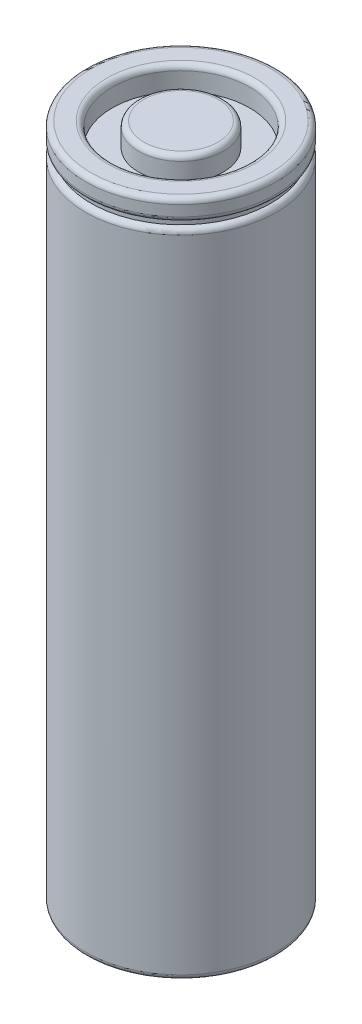
ISO-10303-21;
HEADER;
FILE_DESCRIPTION(('STEP AP214'),'2;1');
FILE_NAME('part.step','',(''),(''),'','','');
FILE_SCHEMA(('AUTOMOTIVE_DESIGN { 1 0 10303 214 1 1 1 1 }'));
ENDSEC;
DATA;
#1=APPLICATION_CONTEXT('core data for automotive mechanical design processes');
#2=APPLICATION_PROTOCOL_DEFINITION('international standard','automotive_design',2000,#1);
#3=PRODUCT_CONTEXT('',#1,'mechanical');
#4=PRODUCT('Part','Part','',(#3));
#5=PRODUCT_RELATED_PRODUCT_CATEGORY('part','',(#4));
#6=PRODUCT_DEFINITION_FORMATION('','',#4);
#7=PRODUCT_DEFINITION_CONTEXT('part definition',#1,'design');
#8=PRODUCT_DEFINITION('design','',#6,#7);
#9=PRODUCT_DEFINITION_SHAPE('','',#8);
#10=(LENGTH_UNIT() NAMED_UNIT(*) SI_UNIT(.MILLI.,.METRE.));
#11=(NAMED_UNIT(*) PLANE_ANGLE_UNIT() SI_UNIT($,.RADIAN.));
#12=(NAMED_UNIT(*) SI_UNIT($,.STERADIAN.) SOLID_ANGLE_UNIT());
#13=UNCERTAINTY_MEASURE_WITH_UNIT(LENGTH_MEASURE(1.E-05),#10,'distance_accuracy_value','');
#14=(GEOMETRIC_REPRESENTATION_CONTEXT(3) GLOBAL_UNCERTAINTY_ASSIGNED_CONTEXT((#13)) GLOBAL_UNIT_ASSIGNED_CONTEXT((#10,
#11,#12)) REPRESENTATION_CONTEXT('',''));
#15=CARTESIAN_POINT('',(0.,0.,0.));
#16=DIRECTION('',(0.,0.,1.));
#17=DIRECTION('',(1.,0.,0.));
#18=AXIS2_PLACEMENT_3D('',#15,#16,#17);
#19=CARTESIAN_POINT('',(0.,64.,0.));
#20=DIRECTION('',(0.,1.,0.));
#21=DIRECTION('',(0.,0.,1.));
#22=AXIS2_PLACEMENT_3D('',#19,#20,#21);
#23=PLANE('',#22);
#24=CARTESIAN_POINT('',(0.,64.,0.));
#25=DIRECTION('',(0.,1.,0.));
#26=DIRECTION('',(0.,0.,1.));
#27=AXIS2_PLACEMENT_3D('',#24,#25,#26);
#28=CIRCLE('',#27,8.49999999999998);
#29=CARTESIAN_POINT('',(0.,64.,8.49999999999998));
#30=VERTEX_POINT('',#29);
#31=EDGE_CURVE('E49',#30,#30,#28,.T.);
#32=ORIENTED_EDGE('',*,*,#31,.T.);
#33=EDGE_LOOP('',(#32));
#34=FACE_BOUND('',#33,.T.);
#35=CARTESIAN_POINT('',(0.,64.,0.));
#36=DIRECTION('',(0.,1.,0.));
#37=DIRECTION('',(0.,0.,1.));
#38=AXIS2_PLACEMENT_3D('',#35,#36,#37);
#39=CIRCLE('',#38,7.);
#40=CARTESIAN_POINT('',(0.,64.,7.));
#41=VERTEX_POINT('',#40);
#42=EDGE_CURVE('E54',#41,#41,#39,.F.);
#43=ORIENTED_EDGE('',*,*,#42,.T.);
#44=EDGE_LOOP('',(#43));
#45=FACE_BOUND('',#44,.T.);
#46=ADVANCED_FACE('F41',(#34,#45),#23,.T.);
#47=CARTESIAN_POINT('',(0.,0.,0.));
#48=DIRECTION('',(0.,-1.,0.));
#49=DIRECTION('',(0.,0.,-1.));
#50=AXIS2_PLACEMENT_3D('',#47,#48,#49);
#51=CYLINDRICAL_SURFACE('',#50,8.99999999999998);
#52=CARTESIAN_POINT('',(0.,63.5,0.));
#53=DIRECTION('',(0.,1.,0.));
#54=DIRECTION('',(0.,0.,1.));
#55=AXIS2_PLACEMENT_3D('',#52,#53,#54);
#56=CIRCLE('',#55,8.99999999999998);
#57=CARTESIAN_POINT('',(0.,63.5,8.99999999999998));
#58=VERTEX_POINT('',#57);
#59=EDGE_CURVE('E59',#58,#58,#56,.F.);
#60=ORIENTED_EDGE('',*,*,#59,.T.);
#61=EDGE_LOOP('',(#60));
#62=FACE_BOUND('',#61,.T.);
#63=CARTESIAN_POINT('',(0.,62.5,0.));
#64=DIRECTION('',(0.,-1.,0.));
#65=DIRECTION('',(0.,0.,-1.));
#66=AXIS2_PLACEMENT_3D('',#63,#64,#65);
#67=CIRCLE('',#66,8.99999999999998);
#68=CARTESIAN_POINT('',(0.,62.5,-8.99999999999998));
#69=VERTEX_POINT('',#68);
#70=EDGE_CURVE('E77',#69,#69,#67,.F.);
#71=ORIENTED_EDGE('',*,*,#70,.T.);
#72=EDGE_LOOP('',(#71));
#73=FACE_BOUND('',#72,.T.);
#74=ADVANCED_FACE('F126',(#62,#73),#51,.T.);
#75=CARTESIAN_POINT('',(0.,0.,0.));
#76=DIRECTION('',(0.,-1.,0.));
#77=DIRECTION('',(0.,0.,-1.));
#78=AXIS2_PLACEMENT_3D('',#75,#76,#77);
#79=CYLINDRICAL_SURFACE('',#78,8.49999999999999);
#80=CARTESIAN_POINT('',(0.,62.,0.));
#81=DIRECTION('',(0.,-1.,0.));
#82=DIRECTION('',(0.,0.,-1.));
#83=AXIS2_PLACEMENT_3D('',#80,#81,#82);
#84=CIRCLE('',#83,8.49999999999999);
#85=CARTESIAN_POINT('',(0.,62.,-8.49999999999999));
#86=VERTEX_POINT('',#85);
#87=EDGE_CURVE('E89',#86,#86,#84,.T.);
#88=ORIENTED_EDGE('',*,*,#87,.T.);
#89=EDGE_LOOP('',(#88));
#90=FACE_BOUND('',#89,.T.);
#91=CARTESIAN_POINT('',(0.,61.5,0.));
#92=DIRECTION('',(0.,-1.,0.));
#93=DIRECTION('',(0.,0.,-1.));
#94=AXIS2_PLACEMENT_3D('',#91,#92,#93);
#95=CIRCLE('',#94,8.49999999999999);
#96=CARTESIAN_POINT('',(0.,61.5,-8.49999999999999));
#97=VERTEX_POINT('',#96);
#98=EDGE_CURVE('E93',#97,#97,#95,.T.);
#99=ORIENTED_EDGE('',*,*,#98,.F.);
#100=EDGE_LOOP('',(#99));
#101=FACE_BOUND('',#100,.T.);
#102=ADVANCED_FACE('F131',(#90,#101),#79,.T.);
#103=CARTESIAN_POINT('',(0.,0.,0.));
#104=DIRECTION('',(0.,-1.,0.));
#105=DIRECTION('',(0.,0.,-1.));
#106=AXIS2_PLACEMENT_3D('',#103,#104,#105);
#107=CYLINDRICAL_SURFACE('',#106,8.99999999999999);
#108=CARTESIAN_POINT('',(0.,61.,0.));
#109=DIRECTION('',(0.,1.,0.));
#110=DIRECTION('',(0.,0.,1.));
#111=AXIS2_PLACEMENT_3D('',#108,#109,#110);
#112=CIRCLE('',#111,8.99999999999999);
#113=CARTESIAN_POINT('',(0.,61.,8.99999999999999));
#114=VERTEX_POINT('',#113);
#115=EDGE_CURVE('E81',#114,#114,#112,.F.);
#116=ORIENTED_EDGE('',*,*,#115,.T.);
#117=EDGE_LOOP('',(#116));
#118=FACE_BOUND('',#117,.T.);
#119=CARTESIAN_POINT('',(0.,0.5,0.));
#120=DIRECTION('',(0.,-1.,0.));
#121=DIRECTION('',(0.,0.,-1.));
#122=AXIS2_PLACEMENT_3D('',#119,#120,#121);
#123=CIRCLE('',#122,8.99999999999999);
#124=CARTESIAN_POINT('',(0.,0.5,-8.99999999999999));
#125=VERTEX_POINT('',#124);
#126=EDGE_CURVE('E85',#125,#125,#123,.F.);
#127=ORIENTED_EDGE('',*,*,#126,.T.);
#128=EDGE_LOOP('',(#127));
#129=FACE_BOUND('',#128,.T.);
#130=ADVANCED_FACE('F165',(#118,#129),#107,.T.);
#131=CARTESIAN_POINT('',(0.,0.,0.));
#132=DIRECTION('',(0.,-1.,0.));
#133=DIRECTION('',(0.,0.,-1.));
#134=AXIS2_PLACEMENT_3D('',#131,#132,#133);
#135=PLANE('',#134);
#136=CARTESIAN_POINT('',(0.,0.,0.));
#137=DIRECTION('',(0.,-1.,0.));
#138=DIRECTION('',(0.,0.,-1.));
#139=AXIS2_PLACEMENT_3D('',#136,#137,#138);
#140=CIRCLE('',#139,8.49999999999999);
#141=CARTESIAN_POINT('',(0.,0.,-8.49999999999999));
#142=VERTEX_POINT('',#141);
#143=EDGE_CURVE('E73',#142,#142,#140,.T.);
#144=ORIENTED_EDGE('',*,*,#143,.T.);
#145=EDGE_LOOP('',(#144));
#146=FACE_BOUND('',#145,.T.);
#147=ADVANCED_FACE('F140',(#146),#135,.T.);
#148=CARTESIAN_POINT('',(0.,61.,0.));
#149=DIRECTION('',(0.,1.,0.));
#150=DIRECTION('',(0.,0.,1.));
#151=AXIS2_PLACEMENT_3D('',#148,#149,#150);
#152=TOROIDAL_SURFACE('',#151,8.49999999999999,0.5);
#153=ORIENTED_EDGE('',*,*,#98,.T.);
#154=EDGE_LOOP('',(#153));
#155=FACE_BOUND('',#154,.T.);
#156=ORIENTED_EDGE('',*,*,#115,.F.);
#157=EDGE_LOOP('',(#156));
#158=FACE_BOUND('',#157,.T.);
#159=ADVANCED_FACE('F137',(#155,#158),#152,.T.);
#160=CARTESIAN_POINT('',(0.,62.5,0.));
#161=DIRECTION('',(0.,-1.,0.));
#162=DIRECTION('',(0.,0.,-1.));
#163=AXIS2_PLACEMENT_3D('',#160,#161,#162);
#164=TOROIDAL_SURFACE('',#163,8.49999999999998,0.5);
#165=ORIENTED_EDGE('',*,*,#70,.F.);
#166=EDGE_LOOP('',(#165));
#167=FACE_BOUND('',#166,.T.);
#168=ORIENTED_EDGE('',*,*,#87,.F.);
#169=EDGE_LOOP('',(#168));
#170=FACE_BOUND('',#169,.T.);
#171=ADVANCED_FACE('F121',(#167,#170),#164,.T.);
#172=CARTESIAN_POINT('',(0.,0.5,0.));
#173=DIRECTION('',(0.,-1.,0.));
#174=DIRECTION('',(0.,0.,-1.));
#175=AXIS2_PLACEMENT_3D('',#172,#173,#174);
#176=TOROIDAL_SURFACE('',#175,8.49999999999999,0.5);
#177=ORIENTED_EDGE('',*,*,#126,.F.);
#178=EDGE_LOOP('',(#177));
#179=FACE_BOUND('',#178,.T.);
#180=ORIENTED_EDGE('',*,*,#143,.F.);
#181=EDGE_LOOP('',(#180));
#182=FACE_BOUND('',#181,.T.);
#183=ADVANCED_FACE('F116',(#179,#182),#176,.T.);
#184=CARTESIAN_POINT('',(0.,61.8,0.));
#185=DIRECTION('',(0.,1.,0.));
#186=DIRECTION('',(0.,0.,1.));
#187=AXIS2_PLACEMENT_3D('',#184,#185,#186);
#188=CYLINDRICAL_SURFACE('',#187,6.5);
#189=CARTESIAN_POINT('',(0.,63.5,0.));
#190=DIRECTION('',(0.,1.,0.));
#191=DIRECTION('',(0.,0.,1.));
#192=AXIS2_PLACEMENT_3D('',#189,#190,#191);
#193=CIRCLE('',#192,6.5);
#194=CARTESIAN_POINT('',(0.,63.5,6.5));
#195=VERTEX_POINT('',#194);
#196=EDGE_CURVE('E10',#195,#195,#193,.T.);
#197=ORIENTED_EDGE('',*,*,#196,.T.);
#198=EDGE_LOOP('',(#197));
#199=FACE_BOUND('',#198,.T.);
#200=CARTESIAN_POINT('',(0.,61.8,0.));
#201=DIRECTION('',(0.,1.,0.));
#202=DIRECTION('',(0.,0.,1.));
#203=AXIS2_PLACEMENT_3D('',#200,#201,#202);
#204=CIRCLE('',#203,6.5);
#205=CARTESIAN_POINT('',(0.,61.8,6.5));
#206=VERTEX_POINT('',#205);
#207=EDGE_CURVE('E97',#206,#206,#204,.T.);
#208=ORIENTED_EDGE('',*,*,#207,.F.);
#209=EDGE_LOOP('',(#208));
#210=FACE_BOUND('',#209,.T.);
#211=ADVANCED_FACE('F111',(#199,#210),#188,.F.);
#212=CARTESIAN_POINT('',(0.,61.8,0.));
#213=DIRECTION('',(0.,1.,0.));
#214=DIRECTION('',(0.,0.,1.));
#215=AXIS2_PLACEMENT_3D('',#212,#213,#214);
#216=PLANE('',#215);
#217=CARTESIAN_POINT('',(0.,61.8,0.));
#218=DIRECTION('',(0.,1.,0.));
#219=DIRECTION('',(0.,0.,1.));
#220=AXIS2_PLACEMENT_3D('',#217,#218,#219);
#221=CIRCLE('',#220,4.);
#222=CARTESIAN_POINT('',(0.,61.8,4.));
#223=VERTEX_POINT('',#222);
#224=EDGE_CURVE('E101',#223,#223,#221,.T.);
#225=ORIENTED_EDGE('',*,*,#224,.F.);
#226=EDGE_LOOP('',(#225));
#227=FACE_BOUND('',#226,.T.);
#228=ORIENTED_EDGE('',*,*,#207,.T.);
#229=EDGE_LOOP('',(#228));
#230=FACE_BOUND('',#229,.T.);
#231=ADVANCED_FACE('F108',(#227,#230),#216,.T.);
#232=CARTESIAN_POINT('',(0.,75.3137084989848,0.));
#233=DIRECTION('',(0.,-1.,0.));
#234=DIRECTION('',(0.,0.,-1.));
#235=AXIS2_PLACEMENT_3D('',#232,#233,#234);
#236=CYLINDRICAL_SURFACE('',#235,4.);
#237=CARTESIAN_POINT('',(0.,63.5,0.));
#238=DIRECTION('',(0.,1.,0.));
#239=DIRECTION('',(0.,0.,1.));
#240=AXIS2_PLACEMENT_3D('',#237,#238,#239);
#241=CIRCLE('',#240,4.);
#242=CARTESIAN_POINT('',(0.,63.5,4.));
#243=VERTEX_POINT('',#242);
#244=EDGE_CURVE('E65',#243,#243,#241,.F.);
#245=ORIENTED_EDGE('',*,*,#244,.T.);
#246=EDGE_LOOP('',(#245));
#247=FACE_BOUND('',#246,.T.);
#248=ORIENTED_EDGE('',*,*,#224,.T.);
#249=EDGE_LOOP('',(#248));
#250=FACE_BOUND('',#249,.T.);
#251=ADVANCED_FACE('F106',(#247,#250),#236,.T.);
#252=CARTESIAN_POINT('',(0.,64.,0.));
#253=DIRECTION('',(0.,1.,0.));
#254=DIRECTION('',(0.,0.,1.));
#255=AXIS2_PLACEMENT_3D('',#252,#253,#254);
#256=PLANE('',#255);
#257=CARTESIAN_POINT('',(0.,64.,0.));
#258=DIRECTION('',(0.,1.,0.));
#259=DIRECTION('',(0.,0.,1.));
#260=AXIS2_PLACEMENT_3D('',#257,#258,#259);
#261=CIRCLE('',#260,3.5);
#262=CARTESIAN_POINT('',(0.,64.,3.5));
#263=VERTEX_POINT('',#262);
#264=EDGE_CURVE('E69',#263,#263,#261,.T.);
#265=ORIENTED_EDGE('',*,*,#264,.T.);
#266=EDGE_LOOP('',(#265));
#267=FACE_BOUND('',#266,.T.);
#268=ADVANCED_FACE('F148',(#267),#256,.T.);
#269=CARTESIAN_POINT('',(0.,63.5,0.));
#270=DIRECTION('',(0.,1.,0.));
#271=DIRECTION('',(0.,0.,1.));
#272=AXIS2_PLACEMENT_3D('',#269,#270,#271);
#273=TOROIDAL_SURFACE('',#272,3.5,0.5);
#274=ORIENTED_EDGE('',*,*,#244,.F.);
#275=EDGE_LOOP('',(#274));
#276=FACE_BOUND('',#275,.T.);
#277=ORIENTED_EDGE('',*,*,#264,.F.);
#278=EDGE_LOOP('',(#277));
#279=FACE_BOUND('',#278,.T.);
#280=ADVANCED_FACE('F145',(#276,#279),#273,.T.);
#281=CARTESIAN_POINT('',(0.,63.5,0.));
#282=DIRECTION('',(0.,1.,0.));
#283=DIRECTION('',(0.,0.,1.));
#284=AXIS2_PLACEMENT_3D('',#281,#282,#283);
#285=TOROIDAL_SURFACE('',#284,8.49999999999998,0.5);
#286=ORIENTED_EDGE('',*,*,#31,.F.);
#287=EDGE_LOOP('',(#286));
#288=FACE_BOUND('',#287,.T.);
#289=ORIENTED_EDGE('',*,*,#59,.F.);
#290=EDGE_LOOP('',(#289));
#291=FACE_BOUND('',#290,.T.);
#292=ADVANCED_FACE('F147',(#288,#291),#285,.T.);
#293=CARTESIAN_POINT('',(0.,63.5,0.));
#294=DIRECTION('',(0.,1.,0.));
#295=DIRECTION('',(0.,0.,1.));
#296=AXIS2_PLACEMENT_3D('',#293,#294,#295);
#297=TOROIDAL_SURFACE('',#296,7.,0.5);
#298=ORIENTED_EDGE('',*,*,#42,.F.);
#299=EDGE_LOOP('',(#298));
#300=FACE_BOUND('',#299,.T.);
#301=ORIENTED_EDGE('',*,*,#196,.F.);
#302=EDGE_LOOP('',(#301));
#303=FACE_BOUND('',#302,.T.);
#304=ADVANCED_FACE('F43',(#300,#303),#297,.T.);
#305=CLOSED_SHELL('',(#46,#74,#102,#130,#147,#159,#171,#183,#211,#231,#251,#268,#280,#292,#304));
#306=MANIFOLD_SOLID_BREP('B2',#305);
#307=ADVANCED_BREP_SHAPE_REPRESENTATION('',(#18,#306),#14);
#308=SHAPE_DEFINITION_REPRESENTATION(#9,#307);
ENDSEC;
END-ISO-10303-21;
